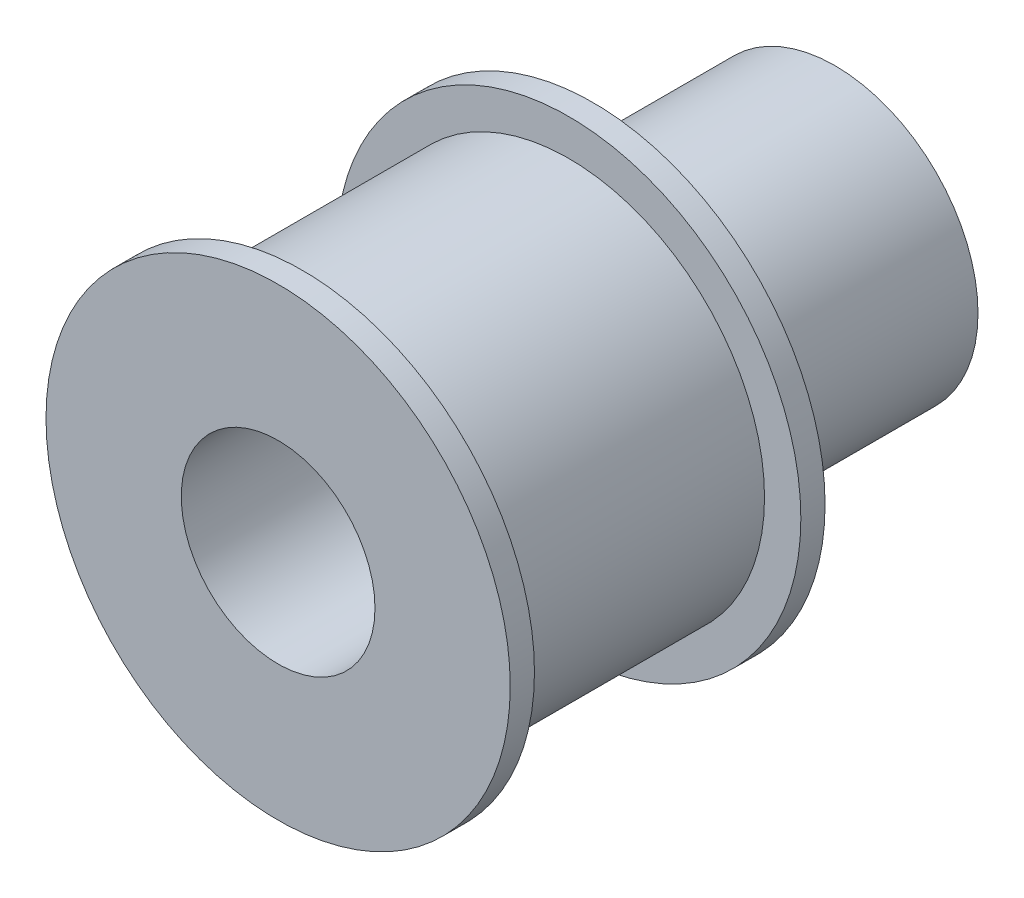
ISO-10303-21;
HEADER;
FILE_DESCRIPTION(('STEP AP214'),'2;1');
FILE_NAME('part.step','',(''),(''),'','','');
FILE_SCHEMA(('AUTOMOTIVE_DESIGN { 1 0 10303 214 1 1 1 1 }'));
ENDSEC;
DATA;
#1=APPLICATION_CONTEXT('core data for automotive mechanical design processes');
#2=APPLICATION_PROTOCOL_DEFINITION('international standard','automotive_design',2000,#1);
#3=PRODUCT_CONTEXT('',#1,'mechanical');
#4=PRODUCT('Part','Part','',(#3));
#5=PRODUCT_RELATED_PRODUCT_CATEGORY('part','',(#4));
#6=PRODUCT_DEFINITION_FORMATION('','',#4);
#7=PRODUCT_DEFINITION_CONTEXT('part definition',#1,'design');
#8=PRODUCT_DEFINITION('design','',#6,#7);
#9=PRODUCT_DEFINITION_SHAPE('','',#8);
#10=(LENGTH_UNIT() NAMED_UNIT(*) SI_UNIT(.MILLI.,.METRE.));
#11=(NAMED_UNIT(*) PLANE_ANGLE_UNIT() SI_UNIT($,.RADIAN.));
#12=(NAMED_UNIT(*) SI_UNIT($,.STERADIAN.) SOLID_ANGLE_UNIT());
#13=UNCERTAINTY_MEASURE_WITH_UNIT(LENGTH_MEASURE(1.E-05),#10,'distance_accuracy_value','');
#14=(GEOMETRIC_REPRESENTATION_CONTEXT(3) GLOBAL_UNCERTAINTY_ASSIGNED_CONTEXT((#13)) GLOBAL_UNIT_ASSIGNED_CONTEXT((#10,
#11,#12)) REPRESENTATION_CONTEXT('',''));
#15=CARTESIAN_POINT('',(0.,0.,0.));
#16=DIRECTION('',(0.,0.,1.));
#17=DIRECTION('',(1.,0.,0.));
#18=AXIS2_PLACEMENT_3D('',#15,#16,#17);
#19=CARTESIAN_POINT('',(0.,0.,-23.));
#20=DIRECTION('',(0.,0.,1.));
#21=DIRECTION('',(1.,0.,0.));
#22=AXIS2_PLACEMENT_3D('',#19,#20,#21);
#23=PLANE('',#22);
#24=CARTESIAN_POINT('',(0.,0.,-23.));
#25=DIRECTION('',(0.,0.,1.));
#26=DIRECTION('',(1.,0.,0.));
#27=AXIS2_PLACEMENT_3D('',#24,#25,#26);
#28=CIRCLE('',#27,4.);
#29=CARTESIAN_POINT('',(4.,0.,-23.));
#30=VERTEX_POINT('',#29);
#31=EDGE_CURVE('E77',#30,#30,#28,.T.);
#32=ORIENTED_EDGE('',*,*,#31,.T.);
#33=EDGE_LOOP('',(#32));
#34=FACE_BOUND('',#33,.T.);
#35=CARTESIAN_POINT('',(0.,0.,-23.));
#36=DIRECTION('',(0.,0.,1.));
#37=DIRECTION('',(1.,0.,0.));
#38=AXIS2_PLACEMENT_3D('',#35,#36,#37);
#39=CIRCLE('',#38,5.9);
#40=CARTESIAN_POINT('',(5.9,0.,-23.));
#41=VERTEX_POINT('',#40);
#42=EDGE_CURVE('E10',#41,#41,#39,.T.);
#43=ORIENTED_EDGE('',*,*,#42,.F.);
#44=EDGE_LOOP('',(#43));
#45=FACE_BOUND('',#44,.T.);
#46=ADVANCED_FACE('F32',(#34,#45),#23,.F.);
#47=CARTESIAN_POINT('',(0.,0.,0.));
#48=DIRECTION('',(0.,0.,1.));
#49=DIRECTION('',(1.,0.,0.));
#50=AXIS2_PLACEMENT_3D('',#47,#48,#49);
#51=CYLINDRICAL_SURFACE('',#50,5.9);
#52=CARTESIAN_POINT('',(-5.9,0.,-19.5));
#53=CARTESIAN_POINT('',(-5.89999863185022,0.082830038249949,-19.4999977600463));
#54=CARTESIAN_POINT('',(-5.89823839931483,0.165684832863688,-19.4931161231801));
#55=CARTESIAN_POINT('',(-5.89138713946882,0.329016763273004,-19.4658144839817));
#56=CARTESIAN_POINT('',(-5.88629429539872,0.409492577152411,-19.4453870971584));
#57=CARTESIAN_POINT('',(-5.87334130935856,0.565684557209915,-19.391694073119));
#58=CARTESIAN_POINT('',(-5.86548455288059,0.641406413346793,-19.3584441373572));
#59=CARTESIAN_POINT('',(-5.84783888653407,0.786197875180382,-19.2801058423872));
#60=CARTESIAN_POINT('',(-5.83804989543126,0.855267201012283,-19.2350169854252));
#61=CARTESIAN_POINT('',(-5.81736852160733,0.986260236282173,-19.1332691333772));
#62=CARTESIAN_POINT('',(-5.80645865200953,1.04802249224729,-19.0764058240249));
#63=CARTESIAN_POINT('',(-5.78488032866515,1.16124449896802,-18.9531604749136));
#64=CARTESIAN_POINT('',(-5.77421190322332,1.21270304730156,-18.886777325758));
#65=CARTESIAN_POINT('',(-5.75414745591023,1.30462316017258,-18.7451143294056));
#66=CARTESIAN_POINT('',(-5.74477360042579,1.34490284311052,-18.6697130400231));
#67=CARTESIAN_POINT('',(-5.72861518109046,1.4121517223974,-18.5129323522419));
#68=CARTESIAN_POINT('',(-5.72183018771506,1.43912312697355,-18.4315539481951));
#69=CARTESIAN_POINT('',(-5.71179764583944,1.47843656787612,-18.2669076213725));
#70=CARTESIAN_POINT('',(-5.70847986708463,1.49106951185751,-18.1837135401559));
#71=CARTESIAN_POINT('',(-5.70554728281267,1.50225376807379,-18.0163258125875));
#72=CARTESIAN_POINT('',(-5.70593185287833,1.50080745483598,-17.9321323371801));
#73=CARTESIAN_POINT('',(-5.71029745273476,1.48410606772934,-17.7673754371139));
#74=CARTESIAN_POINT('',(-5.71418785001937,1.46919896212241,-17.6867739606483));
#75=CARTESIAN_POINT('',(-5.72498214747374,1.42655478807359,-17.5292552373139));
#76=CARTESIAN_POINT('',(-5.73188626885181,1.39881677783027,-17.4523382613486));
#77=CARTESIAN_POINT('',(-5.74801240949616,1.33100488852097,-17.3034453553207));
#78=CARTESIAN_POINT('',(-5.75725777350398,1.29080579577386,-17.2315290874183));
#79=CARTESIAN_POINT('',(-5.77701165833937,1.19930036134028,-17.0953387219831));
#80=CARTESIAN_POINT('',(-5.78752040697974,1.14799201509948,-17.0310660069002));
#81=CARTESIAN_POINT('',(-5.80899752020269,1.03392786808934,-16.9099946056233));
#82=CARTESIAN_POINT('',(-5.81997029361514,0.970878777414767,-16.8534726592871));
#83=CARTESIAN_POINT('',(-5.84085966687947,0.836064673045031,-16.7517506565846));
#84=CARTESIAN_POINT('',(-5.85077623225495,0.764299375001822,-16.7065509697307));
#85=CARTESIAN_POINT('',(-5.86848800026142,0.613686789621631,-16.6286499362372));
#86=CARTESIAN_POINT('',(-5.87627532733138,0.534814607701237,-16.5959948134813));
#87=CARTESIAN_POINT('',(-5.888794022969,0.372457781193938,-16.5444848047602));
#88=CARTESIAN_POINT('',(-5.89352599666688,0.288974053507842,-16.5256271860218));
#89=CARTESIAN_POINT('',(-5.899310781984,0.122128930978259,-16.5026730700864));
#90=CARTESIAN_POINT('',(-5.90045746482781,0.0388225405440693,-16.4981998643658));
#91=CARTESIAN_POINT('',(-5.89921045786372,-0.127348889786348,-16.5031065724762));
#92=CARTESIAN_POINT('',(-5.89681709839345,-0.210213970139116,-16.5124851937294));
#93=CARTESIAN_POINT('',(-5.88881920506323,-0.371832681358252,-16.5445191790628));
#94=CARTESIAN_POINT('',(-5.88326468368383,-0.450629972839555,-16.566967886862));
#95=CARTESIAN_POINT('',(-5.86957144444429,-0.603335371703893,-16.6242677846647));
#96=CARTESIAN_POINT('',(-5.8614324605624,-0.67724297483886,-16.6591202514464));
#97=CARTESIAN_POINT('',(-5.84324947975955,-0.819561135349215,-16.7409605829732));
#98=CARTESIAN_POINT('',(-5.83317348261169,-0.88784703835111,-16.7881579359438));
#99=CARTESIAN_POINT('',(-5.81228271270935,-1.01566287928876,-16.893081620569));
#100=CARTESIAN_POINT('',(-5.80146780808341,-1.07519124827461,-16.9508098347333));
#101=CARTESIAN_POINT('',(-5.77997834225626,-1.1853634132032,-17.0769079929036));
#102=CARTESIAN_POINT('',(-5.76931435697359,-1.23574255151291,-17.145511370839));
#103=CARTESIAN_POINT('',(-5.74964010495377,-1.32427465688686,-17.2904196112406));
#104=CARTESIAN_POINT('',(-5.74062976551446,-1.36242816150323,-17.3667241348991));
#105=CARTESIAN_POINT('',(-5.72538357168284,-1.4251403317954,-17.524464710674));
#106=CARTESIAN_POINT('',(-5.71913135785691,-1.44977937476193,-17.6058671429609));
#107=CARTESIAN_POINT('',(-5.71009628596941,-1.48497027292199,-17.7718431278371));
#108=CARTESIAN_POINT('',(-5.70731263802452,-1.49552533544564,-17.8564159539243));
#109=CARTESIAN_POINT('',(-5.70559153423418,-1.50207678454967,-18.0236348791933));
#110=CARTESIAN_POINT('',(-5.70654217289633,-1.4984967416024,-18.1062634926657));
#111=CARTESIAN_POINT('',(-5.71192298396535,-1.47785227797149,-18.2696972947885));
#112=CARTESIAN_POINT('',(-5.71635308175777,-1.4607881464442,-18.3505025225017));
#113=CARTESIAN_POINT('',(-5.72813020683422,-1.41389485565978,-18.5075172237318));
#114=CARTESIAN_POINT('',(-5.73545847233807,-1.38414770718958,-18.5837526947921));
#115=CARTESIAN_POINT('',(-5.75220828882475,-1.3127973032129,-18.7302060608572));
#116=CARTESIAN_POINT('',(-5.76163013983463,-1.27119234814894,-18.8004230913722));
#117=CARTESIAN_POINT('',(-5.78182245060816,-1.17599044237874,-18.9348870157966));
#118=CARTESIAN_POINT('',(-5.79262238972102,-1.12210078652748,-18.9989222771373));
#119=CARTESIAN_POINT('',(-5.81418091410334,-1.00442620910812,-19.1171786035931));
#120=CARTESIAN_POINT('',(-5.82493948888527,-0.940638928395249,-19.1713973221961));
#121=CARTESIAN_POINT('',(-5.84544595559965,-0.803524205218607,-19.2694831419135));
#122=CARTESIAN_POINT('',(-5.8551708925873,-0.730039189018956,-19.3131351427724));
#123=CARTESIAN_POINT('',(-5.8722700689399,-0.576532096973002,-19.387396561732));
#124=CARTESIAN_POINT('',(-5.87964594861095,-0.496514631891308,-19.4180150859347));
#125=CARTESIAN_POINT('',(-5.89015920699172,-0.347230792472992,-19.4609314423992));
#126=CARTESIAN_POINT('',(-5.89382377720494,-0.278659436649339,-19.4755499081574));
#127=CARTESIAN_POINT('',(-5.89874465504577,-0.140064542759633,-19.4950847427563));
#128=CARTESIAN_POINT('',(-5.90000115690815,-0.0700411222776747,-19.5000018941059));
#129=CARTESIAN_POINT('',(-5.9,0.,-19.5));
#130=B_SPLINE_CURVE_WITH_KNOTS('',3,(#52,#53,#54,#55,#56,#57,#58,#59,#60,#61,#62,#63,#64,#65,
#66,#67,#68,#69,#70,#71,#72,#73,#74,#75,#76,#77,#78,#79,#80,#81,#82,#83,#84,#85,#86,#87,#88,#89,
#90,#91,#92,#93,#94,#95,#96,#97,#98,#99,#100,#101,#102,#103,#104,#105,#106,#107,#108,#109,#110,
#111,#112,#113,#114,#115,#116,#117,#118,#119,#120,#121,#122,#123,#124,#125,#126,#127,#128,#129),
.UNSPECIFIED.,.T.,.F.,(4,2,2,2,2,2,2,2,2,2,2,2,2,2,2,2,2,2,2,2,2,2,2,2,2,2,2,2,2,2,2,2,2,2,2,2,
2,2,4),(0.,0.248233394491254,0.496602225258983,0.744667884467356,0.992743974977815,
1.24555261347129,1.49839073705538,1.75512908076637,2.01182480984363,2.26321383822942,
2.51456046950915,2.75959002235279,3.00463756346887,3.25223194832832,3.49987104641959,
3.75482258942744,4.00978245193161,4.26567297297125,4.52151279787066,4.77059551627813,
5.01965499309822,5.26487950095512,5.51012925824521,5.75984636445289,6.0096081542159,
6.26572614204237,6.5218328670036,6.77639940759488,7.03090796611492,7.27784869958147,
7.5247841377293,7.7701464991653,8.015544045635,8.26754847835886,8.51961307003946,
8.77644345520996,9.03309410493864,9.24301732210761,9.45292360616),.UNSPECIFIED.);
#131=CARTESIAN_POINT('',(-5.9,0.,-19.5));
#132=VERTEX_POINT('',#131);
#133=EDGE_CURVE('E57',#132,#132,#130,.T.);
#134=ORIENTED_EDGE('',*,*,#133,.T.);
#135=EDGE_LOOP('',(#134));
#136=FACE_BOUND('',#135,.T.);
#137=CARTESIAN_POINT('',(0.,-5.9,-16.5));
#138=CARTESIAN_POINT('',(0.0828300382499491,-5.89999863185022,-16.5000022399537));
#139=CARTESIAN_POINT('',(0.165684832863688,-5.89823839931483,-16.5068838768199));
#140=CARTESIAN_POINT('',(0.329016763273004,-5.89138713946882,-16.5341855160182));
#141=CARTESIAN_POINT('',(0.409492577152412,-5.88629429539872,-16.5546129028415));
#142=CARTESIAN_POINT('',(0.565684557209916,-5.87334130935856,-16.608305926881));
#143=CARTESIAN_POINT('',(0.641406413346793,-5.86548455288059,-16.6415558626427));
#144=CARTESIAN_POINT('',(0.786197875180383,-5.84783888653407,-16.7198941576128));
#145=CARTESIAN_POINT('',(0.855267201012286,-5.83804989543126,-16.7649830145747));
#146=CARTESIAN_POINT('',(0.986260236282177,-5.81736852160733,-16.8667308666227));
#147=CARTESIAN_POINT('',(1.04802249224729,-5.80645865200953,-16.9235941759751));
#148=CARTESIAN_POINT('',(1.16124449896803,-5.78488032866515,-17.0468395250864));
#149=CARTESIAN_POINT('',(1.21270304730156,-5.77421190322332,-17.113222674242));
#150=CARTESIAN_POINT('',(1.30462316017259,-5.75414745591023,-17.2548856705943));
#151=CARTESIAN_POINT('',(1.34490284311052,-5.74477360042579,-17.3302869599769));
#152=CARTESIAN_POINT('',(1.4121517223974,-5.72861518109046,-17.4870676477581));
#153=CARTESIAN_POINT('',(1.43912312697355,-5.72183018771506,-17.5684460518049));
#154=CARTESIAN_POINT('',(1.47843656787613,-5.71179764583944,-17.7330923786275));
#155=CARTESIAN_POINT('',(1.49106951185751,-5.70847986708463,-17.8162864598441));
#156=CARTESIAN_POINT('',(1.5022537680738,-5.70554728281266,-17.9836741874125));
#157=CARTESIAN_POINT('',(1.50080745483598,-5.70593185287833,-18.0678676628199));
#158=CARTESIAN_POINT('',(1.48410606772934,-5.71029745273476,-18.2326245628861));
#159=CARTESIAN_POINT('',(1.46919896212241,-5.71418785001937,-18.3132260393517));
#160=CARTESIAN_POINT('',(1.42655478807359,-5.72498214747374,-18.470744762686));
#161=CARTESIAN_POINT('',(1.39881677783028,-5.73188626885181,-18.5476617386514));
#162=CARTESIAN_POINT('',(1.33100488852097,-5.74801240949616,-18.6965546446793));
#163=CARTESIAN_POINT('',(1.29080579577386,-5.75725777350398,-18.7684709125817));
#164=CARTESIAN_POINT('',(1.19930036134028,-5.77701165833937,-18.9046612780169));
#165=CARTESIAN_POINT('',(1.14799201509948,-5.78752040697974,-18.9689339930998));
#166=CARTESIAN_POINT('',(1.03392786808934,-5.80899752020269,-19.0900053943766));
#167=CARTESIAN_POINT('',(0.970878777414769,-5.81997029361514,-19.1465273407129));
#168=CARTESIAN_POINT('',(0.836064673045032,-5.84085966687947,-19.2482493434154));
#169=CARTESIAN_POINT('',(0.764299375001824,-5.85077623225495,-19.2934490302693));
#170=CARTESIAN_POINT('',(0.613686789621632,-5.86848800026142,-19.3713500637628));
#171=CARTESIAN_POINT('',(0.534814607701238,-5.87627532733138,-19.4040051865186));
#172=CARTESIAN_POINT('',(0.372457781193938,-5.888794022969,-19.4555151952397));
#173=CARTESIAN_POINT('',(0.288974053507842,-5.89352599666688,-19.4743728139782));
#174=CARTESIAN_POINT('',(0.122128930978259,-5.899310781984,-19.4973269299136));
#175=CARTESIAN_POINT('',(0.0388225405440703,-5.90045746482781,-19.5018001356342));
#176=CARTESIAN_POINT('',(-0.127348889786347,-5.89921045786372,-19.4968934275238));
#177=CARTESIAN_POINT('',(-0.210213970139116,-5.89681709839345,-19.4875148062705));
#178=CARTESIAN_POINT('',(-0.371832681358253,-5.88881920506323,-19.4554808209372));
#179=CARTESIAN_POINT('',(-0.450629972839558,-5.88326468368383,-19.433032113138));
#180=CARTESIAN_POINT('',(-0.603335371703896,-5.86957144444429,-19.3757322153353));
#181=CARTESIAN_POINT('',(-0.677242974838862,-5.8614324605624,-19.3408797485536));
#182=CARTESIAN_POINT('',(-0.819561135349217,-5.84324947975955,-19.2590394170268));
#183=CARTESIAN_POINT('',(-0.887847038351113,-5.83317348261169,-19.2118420640562));
#184=CARTESIAN_POINT('',(-1.01566287928877,-5.81228271270935,-19.1069183794309));
#185=CARTESIAN_POINT('',(-1.07519124827461,-5.80146780808341,-19.0491901652667));
#186=CARTESIAN_POINT('',(-1.1853634132032,-5.77997834225626,-18.9230920070964));
#187=CARTESIAN_POINT('',(-1.23574255151291,-5.76931435697359,-18.854488629161));
#188=CARTESIAN_POINT('',(-1.32427465688686,-5.74964010495377,-18.7095803887593));
#189=CARTESIAN_POINT('',(-1.36242816150323,-5.74062976551446,-18.6332758651008));
#190=CARTESIAN_POINT('',(-1.42514033179541,-5.72538357168284,-18.475535289326));
#191=CARTESIAN_POINT('',(-1.44977937476193,-5.71913135785691,-18.3941328570391));
#192=CARTESIAN_POINT('',(-1.484970272922,-5.71009628596941,-18.2281568721629));
#193=CARTESIAN_POINT('',(-1.49552533544564,-5.70731263802452,-18.1435840460757));
#194=CARTESIAN_POINT('',(-1.50207678454967,-5.70559153423417,-17.9763651208067));
#195=CARTESIAN_POINT('',(-1.49849674160241,-5.70654217289632,-17.8937365073342));
#196=CARTESIAN_POINT('',(-1.47785227797149,-5.71192298396535,-17.7303027052115));
#197=CARTESIAN_POINT('',(-1.4607881464442,-5.71635308175777,-17.6494974774982));
#198=CARTESIAN_POINT('',(-1.41389485565978,-5.72813020683422,-17.4924827762682));
#199=CARTESIAN_POINT('',(-1.38414770718958,-5.73545847233807,-17.4162473052079));
#200=CARTESIAN_POINT('',(-1.3127973032129,-5.75220828882475,-17.2697939391427));
#201=CARTESIAN_POINT('',(-1.27119234814895,-5.76163013983463,-17.1995769086277));
#202=CARTESIAN_POINT('',(-1.17599044237874,-5.78182245060816,-17.0651129842034));
#203=CARTESIAN_POINT('',(-1.12210078652748,-5.79262238972101,-17.0010777228626));
#204=CARTESIAN_POINT('',(-1.00442620910812,-5.81418091410334,-16.8828213964069));
#205=CARTESIAN_POINT('',(-0.940638928395251,-5.82493948888527,-16.8286026778039));
#206=CARTESIAN_POINT('',(-0.803524205218609,-5.84544595559965,-16.7305168580865));
#207=CARTESIAN_POINT('',(-0.730039189018958,-5.8551708925873,-16.6868648572276));
#208=CARTESIAN_POINT('',(-0.576532096973004,-5.8722700689399,-16.612603438268));
#209=CARTESIAN_POINT('',(-0.49651463189131,-5.87964594861095,-16.5819849140653));
#210=CARTESIAN_POINT('',(-0.347230792472992,-5.89015920699172,-16.5390685576007));
#211=CARTESIAN_POINT('',(-0.278659436649339,-5.89382377720494,-16.5244500918426));
#212=CARTESIAN_POINT('',(-0.140064542759633,-5.89874465504577,-16.5049152572436));
#213=CARTESIAN_POINT('',(-0.0700411222776745,-5.90000115690815,-16.499998105894));
#214=CARTESIAN_POINT('',(0.,-5.9,-16.5));
#215=B_SPLINE_CURVE_WITH_KNOTS('',3,(#137,#138,#139,#140,#141,#142,#143,#144,#145,#146,#147,
#148,#149,#150,#151,#152,#153,#154,#155,#156,#157,#158,#159,#160,#161,#162,#163,#164,#165,#166,
#167,#168,#169,#170,#171,#172,#173,#174,#175,#176,#177,#178,#179,#180,#181,#182,#183,#184,#185,
#186,#187,#188,#189,#190,#191,#192,#193,#194,#195,#196,#197,#198,#199,#200,#201,#202,#203,#204,
#205,#206,#207,#208,#209,#210,#211,#212,#213,#214),.UNSPECIFIED.,.T.,.F.,(4,2,2,2,2,2,2,2,2,2,2,
2,2,2,2,2,2,2,2,2,2,2,2,2,2,2,2,2,2,2,2,2,2,2,2,2,2,2,4),(0.,0.248233394491254,
0.496602225258984,0.744667884467356,0.992743974977817,1.2455526134713,1.49839073705538,
1.75512908076637,2.01182480984364,2.26321383822943,2.51456046950916,2.7595900223528,
3.00463756346888,3.25223194832833,3.4998710464196,3.75482258942745,4.00978245193162,
4.26567297297126,4.52151279787067,4.77059551627814,5.01965499309823,5.26487950095513,
5.51012925824523,5.7598463644529,6.00960815421591,6.26572614204238,6.52183286700362,
6.77639940759489,7.03090796611494,7.27784869958149,7.52478413772932,7.77014649916532,
8.01554404563502,8.26754847835888,8.51961307003948,8.77644345520998,9.03309410493866,
9.24301732210763,9.45292360616002),.UNSPECIFIED.);
#216=CARTESIAN_POINT('',(0.,-5.9,-16.5));
#217=VERTEX_POINT('',#216);
#218=EDGE_CURVE('E56',#217,#217,#215,.T.);
#219=ORIENTED_EDGE('',*,*,#218,.T.);
#220=EDGE_LOOP('',(#219));
#221=FACE_BOUND('',#220,.T.);
#222=CARTESIAN_POINT('',(0.,0.,-13.));
#223=DIRECTION('',(0.,0.,1.));
#224=DIRECTION('',(1.,0.,0.));
#225=AXIS2_PLACEMENT_3D('',#222,#223,#224);
#226=CIRCLE('',#225,5.9);
#227=CARTESIAN_POINT('',(5.9,0.,-13.));
#228=VERTEX_POINT('',#227);
#229=EDGE_CURVE('E43',#228,#228,#226,.T.);
#230=ORIENTED_EDGE('',*,*,#229,.F.);
#231=EDGE_LOOP('',(#230));
#232=FACE_BOUND('',#231,.T.);
#233=ORIENTED_EDGE('',*,*,#42,.T.);
#234=EDGE_LOOP('',(#233));
#235=FACE_BOUND('',#234,.T.);
#236=ADVANCED_FACE('F79',(#136,#221,#232,#235),#51,.T.);
#237=CARTESIAN_POINT('',(-5.9,0.,-13.));
#238=DIRECTION('',(0.,0.,1.));
#239=DIRECTION('',(1.,0.,0.));
#240=AXIS2_PLACEMENT_3D('',#237,#238,#239);
#241=PLANE('',#240);
#242=CARTESIAN_POINT('',(0.,0.,-13.));
#243=DIRECTION('',(0.,0.,1.));
#244=DIRECTION('',(1.,0.,0.));
#245=AXIS2_PLACEMENT_3D('',#242,#243,#244);
#246=CIRCLE('',#245,9.58507110906828);
#247=CARTESIAN_POINT('',(9.58507110906828,0.,-13.));
#248=VERTEX_POINT('',#247);
#249=EDGE_CURVE('E48',#248,#248,#246,.T.);
#250=ORIENTED_EDGE('',*,*,#249,.F.);
#251=EDGE_LOOP('',(#250));
#252=FACE_BOUND('',#251,.T.);
#253=ORIENTED_EDGE('',*,*,#229,.T.);
#254=EDGE_LOOP('',(#253));
#255=FACE_BOUND('',#254,.T.);
#256=ADVANCED_FACE('F83',(#252,#255),#241,.F.);
#257=CARTESIAN_POINT('',(0.,0.,0.));
#258=DIRECTION('',(0.,0.,1.));
#259=DIRECTION('',(1.,0.,0.));
#260=AXIS2_PLACEMENT_3D('',#257,#258,#259);
#261=CYLINDRICAL_SURFACE('',#260,9.58507110906828);
#262=CARTESIAN_POINT('',(0.,0.,-12.));
#263=DIRECTION('',(0.,0.,1.));
#264=DIRECTION('',(1.,0.,0.));
#265=AXIS2_PLACEMENT_3D('',#262,#263,#264);
#266=CIRCLE('',#265,9.58507110906828);
#267=CARTESIAN_POINT('',(9.58507110906828,0.,-12.));
#268=VERTEX_POINT('',#267);
#269=EDGE_CURVE('E140',#268,#268,#266,.T.);
#270=ORIENTED_EDGE('',*,*,#269,.F.);
#271=EDGE_LOOP('',(#270));
#272=FACE_BOUND('',#271,.T.);
#273=ORIENTED_EDGE('',*,*,#249,.T.);
#274=EDGE_LOOP('',(#273));
#275=FACE_BOUND('',#274,.T.);
#276=ADVANCED_FACE('F88',(#272,#275),#261,.T.);
#277=CARTESIAN_POINT('',(-9.58507110906828,0.,-12.));
#278=DIRECTION('',(0.,0.,-1.));
#279=DIRECTION('',(-1.,0.,0.));
#280=AXIS2_PLACEMENT_3D('',#277,#278,#279);
#281=PLANE('',#280);
#282=CARTESIAN_POINT('',(0.,0.,-12.));
#283=DIRECTION('',(0.,0.,1.));
#284=DIRECTION('',(1.,0.,0.));
#285=AXIS2_PLACEMENT_3D('',#282,#283,#284);
#286=CIRCLE('',#285,8.08507110906828);
#287=CARTESIAN_POINT('',(8.08507110906828,0.,-12.));
#288=VERTEX_POINT('',#287);
#289=EDGE_CURVE('E137',#288,#288,#286,.T.);
#290=ORIENTED_EDGE('',*,*,#289,.F.);
#291=EDGE_LOOP('',(#290));
#292=FACE_BOUND('',#291,.T.);
#293=ORIENTED_EDGE('',*,*,#269,.T.);
#294=EDGE_LOOP('',(#293));
#295=FACE_BOUND('',#294,.T.);
#296=ADVANCED_FACE('F92',(#292,#295),#281,.F.);
#297=CARTESIAN_POINT('',(0.,0.,0.));
#298=DIRECTION('',(0.,0.,1.));
#299=DIRECTION('',(1.,0.,0.));
#300=AXIS2_PLACEMENT_3D('',#297,#298,#299);
#301=CYLINDRICAL_SURFACE('',#300,8.08507110906828);
#302=CARTESIAN_POINT('',(0.,0.,-1.));
#303=DIRECTION('',(0.,0.,1.));
#304=DIRECTION('',(1.,0.,0.));
#305=AXIS2_PLACEMENT_3D('',#302,#303,#304);
#306=CIRCLE('',#305,8.08507110906828);
#307=CARTESIAN_POINT('',(8.08507110906828,0.,-1.));
#308=VERTEX_POINT('',#307);
#309=EDGE_CURVE('E134',#308,#308,#306,.T.);
#310=ORIENTED_EDGE('',*,*,#309,.F.);
#311=EDGE_LOOP('',(#310));
#312=FACE_BOUND('',#311,.T.);
#313=ORIENTED_EDGE('',*,*,#289,.T.);
#314=EDGE_LOOP('',(#313));
#315=FACE_BOUND('',#314,.T.);
#316=ADVANCED_FACE('F96',(#312,#315),#301,.T.);
#317=CARTESIAN_POINT('',(-8.08507110906828,0.,-1.));
#318=DIRECTION('',(0.,0.,1.));
#319=DIRECTION('',(1.,0.,0.));
#320=AXIS2_PLACEMENT_3D('',#317,#318,#319);
#321=PLANE('',#320);
#322=CARTESIAN_POINT('',(0.,0.,-1.));
#323=DIRECTION('',(0.,0.,1.));
#324=DIRECTION('',(1.,0.,0.));
#325=AXIS2_PLACEMENT_3D('',#322,#323,#324);
#326=CIRCLE('',#325,9.58507110906828);
#327=CARTESIAN_POINT('',(9.58507110906828,0.,-1.));
#328=VERTEX_POINT('',#327);
#329=EDGE_CURVE('E127',#328,#328,#326,.T.);
#330=ORIENTED_EDGE('',*,*,#329,.F.);
#331=EDGE_LOOP('',(#330));
#332=FACE_BOUND('',#331,.T.);
#333=ORIENTED_EDGE('',*,*,#309,.T.);
#334=EDGE_LOOP('',(#333));
#335=FACE_BOUND('',#334,.T.);
#336=ADVANCED_FACE('F100',(#332,#335),#321,.F.);
#337=CARTESIAN_POINT('',(0.,0.,0.));
#338=DIRECTION('',(0.,0.,1.));
#339=DIRECTION('',(1.,0.,0.));
#340=AXIS2_PLACEMENT_3D('',#337,#338,#339);
#341=CYLINDRICAL_SURFACE('',#340,9.58507110906829);
#342=CARTESIAN_POINT('',(0.,0.,0.));
#343=DIRECTION('',(0.,0.,1.));
#344=DIRECTION('',(1.,0.,0.));
#345=AXIS2_PLACEMENT_3D('',#342,#343,#344);
#346=CIRCLE('',#345,9.5850711090683);
#347=CARTESIAN_POINT('',(9.5850711090683,0.,0.));
#348=VERTEX_POINT('',#347);
#349=EDGE_CURVE('E125',#348,#348,#346,.T.);
#350=ORIENTED_EDGE('',*,*,#349,.F.);
#351=EDGE_LOOP('',(#350));
#352=FACE_BOUND('',#351,.T.);
#353=ORIENTED_EDGE('',*,*,#329,.T.);
#354=EDGE_LOOP('',(#353));
#355=FACE_BOUND('',#354,.T.);
#356=ADVANCED_FACE('F104',(#352,#355),#341,.T.);
#357=CARTESIAN_POINT('',(-9.5850711090683,0.,0.));
#358=DIRECTION('',(0.,0.,-1.));
#359=DIRECTION('',(-1.,0.,0.));
#360=AXIS2_PLACEMENT_3D('',#357,#358,#359);
#361=PLANE('',#360);
#362=CARTESIAN_POINT('',(0.,0.,0.));
#363=DIRECTION('',(0.,0.,1.));
#364=DIRECTION('',(1.,0.,0.));
#365=AXIS2_PLACEMENT_3D('',#362,#363,#364);
#366=CIRCLE('',#365,4.);
#367=CARTESIAN_POINT('',(4.,0.,0.));
#368=VERTEX_POINT('',#367);
#369=EDGE_CURVE('E74',#368,#368,#366,.T.);
#370=ORIENTED_EDGE('',*,*,#369,.F.);
#371=EDGE_LOOP('',(#370));
#372=FACE_BOUND('',#371,.T.);
#373=ORIENTED_EDGE('',*,*,#349,.T.);
#374=EDGE_LOOP('',(#373));
#375=FACE_BOUND('',#374,.T.);
#376=ADVANCED_FACE('F107',(#372,#375),#361,.F.);
#377=CARTESIAN_POINT('',(0.,0.,-23.));
#378=DIRECTION('',(0.,0.,1.));
#379=DIRECTION('',(1.,0.,0.));
#380=AXIS2_PLACEMENT_3D('',#377,#378,#379);
#381=CYLINDRICAL_SURFACE('',#380,4.);
#382=CARTESIAN_POINT('',(-4.,0.,-19.5));
#383=CARTESIAN_POINT('',(-4.00000217456151,-0.0812350589378525,-19.5000029023031));
#384=CARTESIAN_POINT('',(-3.99750379283184,-0.162450241781792,-19.4933802397516));
#385=CARTESIAN_POINT('',(-3.98778696006928,-0.32245345235236,-19.4671718047301));
#386=CARTESIAN_POINT('',(-3.98056918893993,-0.401241827987615,-19.4475878995294));
#387=CARTESIAN_POINT('',(-3.96218832391545,-0.554060784990877,-19.3962469982282));
#388=CARTESIAN_POINT('',(-3.9510328434944,-0.628100224162275,-19.3645134831782));
#389=CARTESIAN_POINT('',(-3.92588767765353,-0.76979931016025,-19.2898935869842));
#390=CARTESIAN_POINT('',(-3.91189723227548,-0.837457239177876,-19.2470042144558));
#391=CARTESIAN_POINT('',(-3.88186246971217,-0.967346417045822,-19.1493874689291));
#392=CARTESIAN_POINT('',(-3.86576002583566,-1.02927073015119,-19.0942697377406));
#393=CARTESIAN_POINT('',(-3.83360220871327,-1.14324421474363,-18.9745895653411));
#394=CARTESIAN_POINT('',(-3.81754685135033,-1.19529036359202,-18.9100242439121));
#395=CARTESIAN_POINT('',(-3.78662470617731,-1.28998202215985,-18.7702825324768));
#396=CARTESIAN_POINT('',(-3.77182648820818,-1.33219393195759,-18.6947956334542));
#397=CARTESIAN_POINT('',(-3.74599860237433,-1.40318646334084,-18.5371516458315));
#398=CARTESIAN_POINT('',(-3.73496742975881,-1.43197244961239,-18.4549972368449));
#399=CARTESIAN_POINT('',(-3.71854412824136,-1.47408431017549,-18.2898832597418));
#400=CARTESIAN_POINT('',(-3.71293924350838,-1.48799593218557,-18.2070949615645));
#401=CARTESIAN_POINT('',(-3.70738061461215,-1.50179556531648,-18.0401838420061));
#402=CARTESIAN_POINT('',(-3.70742453659305,-1.5016893680263,-17.9560615861255));
#403=CARTESIAN_POINT('',(-3.71297511632055,-1.48790429610018,-17.794230474787));
#404=CARTESIAN_POINT('',(-3.71815468871122,-1.47503808509003,-17.7164390939558));
#405=CARTESIAN_POINT('',(-3.7328493805953,-1.4374416786833,-17.5642128495947));
#406=CARTESIAN_POINT('',(-3.74236515298863,-1.41270969663258,-17.4897784933861));
#407=CARTESIAN_POINT('',(-3.76485702190253,-1.35163748571903,-17.3447229322718));
#408=CARTESIAN_POINT('',(-3.77789517988166,-1.315086487371,-17.2742005138787));
#409=CARTESIAN_POINT('',(-3.80594210139319,-1.23156073762697,-17.140054262409));
#410=CARTESIAN_POINT('',(-3.82095154457158,-1.18458238728896,-17.0764328224803));
#411=CARTESIAN_POINT('',(-3.85248038859113,-1.07781780766548,-16.9533963363491));
#412=CARTESIAN_POINT('',(-3.86903347455671,-1.01738298716955,-16.8945513592519));
#413=CARTESIAN_POINT('',(-3.90091728164086,-0.887312590819019,-16.7876620337942));
#414=CARTESIAN_POINT('',(-3.91624781465952,-0.817675603497362,-16.7396193453943));
#415=CARTESIAN_POINT('',(-3.9442639480908,-0.669723436992419,-16.6550696029375));
#416=CARTESIAN_POINT('',(-3.95690498259616,-0.591290713844719,-16.6187524187789));
#417=CARTESIAN_POINT('',(-3.97778718326962,-0.428836850524584,-16.56001739573));
#418=CARTESIAN_POINT('',(-3.98603030341493,-0.344818210845768,-16.5375933834389));
#419=CARTESIAN_POINT('',(-3.99684443228065,-0.178375243148666,-16.5083772124581));
#420=CARTESIAN_POINT('',(-3.99969369025686,-0.0961036195622105,-16.5008173936175));
#421=CARTESIAN_POINT('',(-4.00025893700126,0.0685724752550229,-16.4993089361001));
#422=CARTESIAN_POINT('',(-3.99797606386863,0.150976912983371,-16.5053572796832));
#423=CARTESIAN_POINT('',(-3.98871709772643,0.310262048561858,-16.5303100423087));
#424=CARTESIAN_POINT('',(-3.98192470962305,0.387233328007334,-16.5487115437371));
#425=CARTESIAN_POINT('',(-3.96451477091717,0.536941754957219,-16.5971860725473));
#426=CARTESIAN_POINT('',(-3.9538967228203,0.609678350347532,-16.627260617948));
#427=CARTESIAN_POINT('',(-3.92949624407682,0.751247765110152,-16.6991864124395));
#428=CARTESIAN_POINT('',(-3.91563000209348,0.819903083557792,-16.7413577292234));
#429=CARTESIAN_POINT('',(-3.88626671564664,0.949392711726622,-16.8359181031715));
#430=CARTESIAN_POINT('',(-3.87076907009516,1.01022412027045,-16.8883109325451));
#431=CARTESIAN_POINT('',(-3.8387332949099,1.12603079874454,-17.0054041221243));
#432=CARTESIAN_POINT('',(-3.82218696503729,1.18046154123568,-17.0706421827727));
#433=CARTESIAN_POINT('',(-3.79078815746854,1.27771050031903,-17.2096513847077));
#434=CARTESIAN_POINT('',(-3.77593583194399,1.32052767414518,-17.2834232913885));
#435=CARTESIAN_POINT('',(-3.74966829822463,1.39337773518997,-17.4380159867723));
#436=CARTESIAN_POINT('',(-3.73826760328493,1.42335685446918,-17.5188647459104));
#437=CARTESIAN_POINT('',(-3.72054032891005,1.46907883466889,-17.6850097636878));
#438=CARTESIAN_POINT('',(-3.71421061057491,1.48483050305535,-17.7703032361981));
#439=CARTESIAN_POINT('',(-3.70775894792574,1.50086347097839,-17.9370161595411));
#440=CARTESIAN_POINT('',(-3.70726444523341,1.50207331495837,-18.0183326317169));
#441=CARTESIAN_POINT('',(-3.71158412745292,1.49136715641592,-18.1799453162762));
#442=CARTESIAN_POINT('',(-3.71639780898899,1.47945239850123,-18.2602416246716));
#443=CARTESIAN_POINT('',(-3.73048141585433,1.44355815630241,-18.4150472267165));
#444=CARTESIAN_POINT('',(-3.73961085376663,1.41995798316524,-18.4896583462453));
#445=CARTESIAN_POINT('',(-3.76121548297845,1.36169696779919,-18.6339055084944));
#446=CARTESIAN_POINT('',(-3.77369151995215,1.32703332944944,-18.7035402880701));
#447=CARTESIAN_POINT('',(-3.80139723903965,1.24552075938154,-18.8398267896976));
#448=CARTESIAN_POINT('',(-3.81673698440964,1.1981283280301,-18.9061307967999));
#449=CARTESIAN_POINT('',(-3.84806246757177,1.09334485729906,-19.0301415609712));
#450=CARTESIAN_POINT('',(-3.86404840943145,1.03595064012808,-19.0878455747867));
#451=CARTESIAN_POINT('',(-3.89590424609881,0.909080396784621,-19.1962019558218));
#452=CARTESIAN_POINT('',(-3.91172104900645,0.839118644212989,-19.2463037534347));
#453=CARTESIAN_POINT('',(-3.94054514457031,0.691213223200818,-19.3340226552765));
#454=CARTESIAN_POINT('',(-3.95355221851559,0.61326893409062,-19.3716387877364));
#455=CARTESIAN_POINT('',(-3.9757429260668,0.447999082002312,-19.4343768290483));
#456=CARTESIAN_POINT('',(-3.98473657158356,0.360413422234208,-19.4588870646019));
#457=CARTESIAN_POINT('',(-3.99686242179587,0.181875733606382,-19.4916929599207));
#458=CARTESIAN_POINT('',(-3.99999756603967,0.0909254163648588,-19.4999967514873));
#459=CARTESIAN_POINT('',(-4.,0.,-19.5));
#460=B_SPLINE_CURVE_WITH_KNOTS('',3,(#382,#383,#384,#385,#386,#387,#388,#389,#390,#391,#392,
#393,#394,#395,#396,#397,#398,#399,#400,#401,#402,#403,#404,#405,#406,#407,#408,#409,#410,#411,
#412,#413,#414,#415,#416,#417,#418,#419,#420,#421,#422,#423,#424,#425,#426,#427,#428,#429,#430,
#431,#432,#433,#434,#435,#436,#437,#438,#439,#440,#441,#442,#443,#444,#445,#446,#447,#448,#449,
#450,#451,#452,#453,#454,#455,#456,#457,#458,#459),.UNSPECIFIED.,.T.,.F.,(4,2,2,2,2,2,2,2,2,2,2,
2,2,2,2,2,2,2,2,2,2,2,2,2,2,2,2,2,2,2,2,2,2,2,2,2,2,2,4),(0.,0.243369801560559,
0.486704549530459,0.729571369213569,0.972503379609486,1.22473618582715,1.47704604925621,
1.73896674501658,2.00078269352133,2.25185874416901,2.50283106079707,2.73878345119971,
2.97477138060589,3.21522408387018,3.45575990744258,3.71246153335812,3.96920257905065,
4.22991375286074,4.49050899698845,4.73725019635924,4.98393668390519,5.22114437923839,
5.45838293254452,5.70259221859598,5.94689180019866,6.20536519455657,6.4638617892014,
6.72343066727203,6.98283874956505,7.22558763480251,7.46831350211257,7.70363142426531,
7.93900886656504,8.18672471884269,8.4345194199706,8.69572329654037,8.956947498051,
9.2294851503204,9.50188601796125),.UNSPECIFIED.);
#461=CARTESIAN_POINT('',(-4.,0.,-19.5));
#462=VERTEX_POINT('',#461);
#463=EDGE_CURVE('E35',#462,#462,#460,.T.);
#464=ORIENTED_EDGE('',*,*,#463,.T.);
#465=EDGE_LOOP('',(#464));
#466=FACE_BOUND('',#465,.T.);
#467=CARTESIAN_POINT('',(0.,-4.,-16.5));
#468=CARTESIAN_POINT('',(-0.0812350589378528,-4.00000217456151,-16.4999970976969));
#469=CARTESIAN_POINT('',(-0.162450241781792,-3.99750379283184,-16.5066197602484));
#470=CARTESIAN_POINT('',(-0.322453452352361,-3.98778696006928,-16.5328281952699));
#471=CARTESIAN_POINT('',(-0.401241827987616,-3.98056918893993,-16.5524121004706));
#472=CARTESIAN_POINT('',(-0.554060784990879,-3.96218832391545,-16.6037530017718));
#473=CARTESIAN_POINT('',(-0.628100224162278,-3.9510328434944,-16.6354865168218));
#474=CARTESIAN_POINT('',(-0.769799310160254,-3.92588767765353,-16.7101064130158));
#475=CARTESIAN_POINT('',(-0.83745723917788,-3.91189723227548,-16.7529957855441));
#476=CARTESIAN_POINT('',(-0.967346417045826,-3.88186246971217,-16.8506125310709));
#477=CARTESIAN_POINT('',(-1.02927073015119,-3.86576002583566,-16.9057302622594));
#478=CARTESIAN_POINT('',(-1.14324421474363,-3.83360220871327,-17.0254104346588));
#479=CARTESIAN_POINT('',(-1.19529036359203,-3.81754685135033,-17.0899757560879));
#480=CARTESIAN_POINT('',(-1.28998202215985,-3.78662470617731,-17.2297174675232));
#481=CARTESIAN_POINT('',(-1.3321939319576,-3.77182648820818,-17.3052043665458));
#482=CARTESIAN_POINT('',(-1.40318646334085,-3.74599860237433,-17.4628483541685));
#483=CARTESIAN_POINT('',(-1.43197244961239,-3.73496742975881,-17.5450027631551));
#484=CARTESIAN_POINT('',(-1.47408431017549,-3.71854412824136,-17.7101167402582));
#485=CARTESIAN_POINT('',(-1.48799593218558,-3.71293924350838,-17.7929050384354));
#486=CARTESIAN_POINT('',(-1.50179556531648,-3.70738061461215,-17.9598161579938));
#487=CARTESIAN_POINT('',(-1.50168936802631,-3.70742453659305,-18.0439384138745));
#488=CARTESIAN_POINT('',(-1.48790429610018,-3.71297511632055,-18.2057695252129));
#489=CARTESIAN_POINT('',(-1.47503808509003,-3.71815468871122,-18.2835609060442));
#490=CARTESIAN_POINT('',(-1.4374416786833,-3.73284938059529,-18.4357871504053));
#491=CARTESIAN_POINT('',(-1.41270969663258,-3.74236515298863,-18.5102215066139));
#492=CARTESIAN_POINT('',(-1.35163748571904,-3.76485702190253,-18.6552770677282));
#493=CARTESIAN_POINT('',(-1.31508648737101,-3.77789517988166,-18.7257994861213));
#494=CARTESIAN_POINT('',(-1.23156073762698,-3.80594210139319,-18.859945737591));
#495=CARTESIAN_POINT('',(-1.18458238728897,-3.82095154457158,-18.9235671775197));
#496=CARTESIAN_POINT('',(-1.07781780766549,-3.85248038859113,-19.0466036636509));
#497=CARTESIAN_POINT('',(-1.01738298716956,-3.86903347455671,-19.1054486407481));
#498=CARTESIAN_POINT('',(-0.887312590819021,-3.90091728164085,-19.2123379662058));
#499=CARTESIAN_POINT('',(-0.817675603497364,-3.91624781465952,-19.2603806546057));
#500=CARTESIAN_POINT('',(-0.669723436992419,-3.9442639480908,-19.3449303970625));
#501=CARTESIAN_POINT('',(-0.591290713844718,-3.95690498259616,-19.3812475812211));
#502=CARTESIAN_POINT('',(-0.428836850524582,-3.97778718326962,-19.43998260427));
#503=CARTESIAN_POINT('',(-0.344818210845767,-3.98603030341493,-19.4624066165611));
#504=CARTESIAN_POINT('',(-0.178375243148665,-3.99684443228065,-19.4916227875419));
#505=CARTESIAN_POINT('',(-0.0961036195622087,-3.99969369025686,-19.4991826063825));
#506=CARTESIAN_POINT('',(0.0685724752550249,-4.00025893700126,-19.5006910638999));
#507=CARTESIAN_POINT('',(0.150976912983374,-3.99797606386863,-19.4946427203168));
#508=CARTESIAN_POINT('',(0.31026204856186,-3.98871709772643,-19.4696899576913));
#509=CARTESIAN_POINT('',(0.387233328007337,-3.98192470962305,-19.4512884562629));
#510=CARTESIAN_POINT('',(0.536941754957222,-3.96451477091717,-19.4028139274527));
#511=CARTESIAN_POINT('',(0.609678350347535,-3.9538967228203,-19.372739382052));
#512=CARTESIAN_POINT('',(0.751247765110156,-3.92949624407681,-19.3008135875605));
#513=CARTESIAN_POINT('',(0.819903083557796,-3.91563000209348,-19.2586422707766));
#514=CARTESIAN_POINT('',(0.949392711726626,-3.88626671564664,-19.1640818968284));
#515=CARTESIAN_POINT('',(1.01022412027045,-3.87076907009516,-19.1116890674548));
#516=CARTESIAN_POINT('',(1.12603079874454,-3.83873329490989,-18.9945958778757));
#517=CARTESIAN_POINT('',(1.18046154123569,-3.82218696503729,-18.9293578172273));
#518=CARTESIAN_POINT('',(1.27771050031903,-3.79078815746854,-18.7903486152923));
#519=CARTESIAN_POINT('',(1.32052767414519,-3.77593583194399,-18.7165767086115));
#520=CARTESIAN_POINT('',(1.39337773518998,-3.74966829822463,-18.5619840132277));
#521=CARTESIAN_POINT('',(1.42335685446918,-3.73826760328493,-18.4811352540896));
#522=CARTESIAN_POINT('',(1.46907883466889,-3.72054032891005,-18.3149902363122));
#523=CARTESIAN_POINT('',(1.48483050305535,-3.71421061057491,-18.2296967638019));
#524=CARTESIAN_POINT('',(1.50086347097839,-3.70775894792573,-18.0629838404589));
#525=CARTESIAN_POINT('',(1.50207331495837,-3.70726444523341,-17.9816673682831));
#526=CARTESIAN_POINT('',(1.49136715641593,-3.71158412745292,-17.8200546837238));
#527=CARTESIAN_POINT('',(1.47945239850124,-3.71639780898899,-17.7397583753284));
#528=CARTESIAN_POINT('',(1.44355815630242,-3.73048141585432,-17.5849527732834));
#529=CARTESIAN_POINT('',(1.41995798316524,-3.73961085376663,-17.5103416537546));
#530=CARTESIAN_POINT('',(1.3616969677992,-3.76121548297845,-17.3660944915056));
#531=CARTESIAN_POINT('',(1.32703332944945,-3.77369151995215,-17.2964597119298));
#532=CARTESIAN_POINT('',(1.24552075938154,-3.80139723903965,-17.1601732103024));
#533=CARTESIAN_POINT('',(1.1981283280301,-3.81673698440964,-17.0938692032001));
#534=CARTESIAN_POINT('',(1.09334485729906,-3.84806246757177,-16.9698584390288));
#535=CARTESIAN_POINT('',(1.03595064012808,-3.86404840943145,-16.9121544252132));
#536=CARTESIAN_POINT('',(0.909080396784623,-3.89590424609881,-16.8037980441781));
#537=CARTESIAN_POINT('',(0.839118644212993,-3.91172104900645,-16.7536962465653));
#538=CARTESIAN_POINT('',(0.691213223200822,-3.94054514457031,-16.6659773447234));
#539=CARTESIAN_POINT('',(0.613268934090622,-3.95355221851559,-16.6283612122636));
#540=CARTESIAN_POINT('',(0.447999082002312,-3.9757429260668,-16.5656231709517));
#541=CARTESIAN_POINT('',(0.360413422234208,-3.98473657158356,-16.5411129353981));
#542=CARTESIAN_POINT('',(0.181875733606382,-3.99686242179587,-16.5083070400793));
#543=CARTESIAN_POINT('',(0.0909254163648589,-3.99999756603967,-16.5000032485127));
#544=CARTESIAN_POINT('',(0.,-4.,-16.5));
#545=B_SPLINE_CURVE_WITH_KNOTS('',3,(#467,#468,#469,#470,#471,#472,#473,#474,#475,#476,#477,
#478,#479,#480,#481,#482,#483,#484,#485,#486,#487,#488,#489,#490,#491,#492,#493,#494,#495,#496,
#497,#498,#499,#500,#501,#502,#503,#504,#505,#506,#507,#508,#509,#510,#511,#512,#513,#514,#515,
#516,#517,#518,#519,#520,#521,#522,#523,#524,#525,#526,#527,#528,#529,#530,#531,#532,#533,#534,
#535,#536,#537,#538,#539,#540,#541,#542,#543,#544),.UNSPECIFIED.,.T.,.F.,(4,2,2,2,2,2,2,2,2,2,2,
2,2,2,2,2,2,2,2,2,2,2,2,2,2,2,2,2,2,2,2,2,2,2,2,2,2,2,4),(0.,0.24336980156056,0.48670454953046,
0.729571369213575,0.972503379609491,1.22473618582716,1.47704604925622,1.73896674501659,
2.00078269352134,2.25185874416902,2.50283106079707,2.73878345119971,2.97477138060589,
3.21522408387018,3.45575990744258,3.71246153335813,3.96920257905066,4.22991375286075,
4.49050899698846,4.73725019635926,4.98393668390521,5.2211443792384,5.45838293254454,
5.702592218596,5.94689180019868,6.20536519455658,6.46386178920141,6.72343066727204,
6.98283874956507,7.22558763480252,7.46831350211259,7.70363142426533,7.93900886656507,
8.18672471884272,8.43451941997062,8.69572329654039,8.95694749805102,9.22948515032042,
9.50188601796128),.UNSPECIFIED.);
#546=CARTESIAN_POINT('',(0.,-4.,-16.5));
#547=VERTEX_POINT('',#546);
#548=EDGE_CURVE('E51',#547,#547,#545,.T.);
#549=ORIENTED_EDGE('',*,*,#548,.T.);
#550=EDGE_LOOP('',(#549));
#551=FACE_BOUND('',#550,.T.);
#552=ORIENTED_EDGE('',*,*,#31,.F.);
#553=EDGE_LOOP('',(#552));
#554=FACE_BOUND('',#553,.T.);
#555=ORIENTED_EDGE('',*,*,#369,.T.);
#556=EDGE_LOOP('',(#555));
#557=FACE_BOUND('',#556,.T.);
#558=ADVANCED_FACE('F58',(#466,#551,#554,#557),#381,.F.);
#559=CARTESIAN_POINT('',(0.,-9.5850711090683,-18.));
#560=DIRECTION('',(0.,1.,0.));
#561=DIRECTION('',(0.,0.,1.));
#562=AXIS2_PLACEMENT_3D('',#559,#560,#561);
#563=CYLINDRICAL_SURFACE('',#562,1.5);
#564=ORIENTED_EDGE('',*,*,#548,.F.);
#565=EDGE_LOOP('',(#564));
#566=FACE_BOUND('',#565,.T.);
#567=ORIENTED_EDGE('',*,*,#218,.F.);
#568=EDGE_LOOP('',(#567));
#569=FACE_BOUND('',#568,.T.);
#570=ADVANCED_FACE('F61',(#566,#569),#563,.F.);
#571=CARTESIAN_POINT('',(-9.5850711090683,0.,-18.));
#572=DIRECTION('',(1.,0.,0.));
#573=DIRECTION('',(0.,0.,-1.));
#574=AXIS2_PLACEMENT_3D('',#571,#572,#573);
#575=CYLINDRICAL_SURFACE('',#574,1.5);
#576=ORIENTED_EDGE('',*,*,#463,.F.);
#577=EDGE_LOOP('',(#576));
#578=FACE_BOUND('',#577,.T.);
#579=ORIENTED_EDGE('',*,*,#133,.F.);
#580=EDGE_LOOP('',(#579));
#581=FACE_BOUND('',#580,.T.);
#582=ADVANCED_FACE('F64',(#578,#581),#575,.F.);
#583=CLOSED_SHELL('',(#46,#236,#256,#276,#296,#316,#336,#356,#376,#558,#570,#582));
#584=MANIFOLD_SOLID_BREP('B2',#583);
#585=ADVANCED_BREP_SHAPE_REPRESENTATION('',(#18,#584),#14);
#586=SHAPE_DEFINITION_REPRESENTATION(#9,#585);
ENDSEC;
END-ISO-10303-21;
